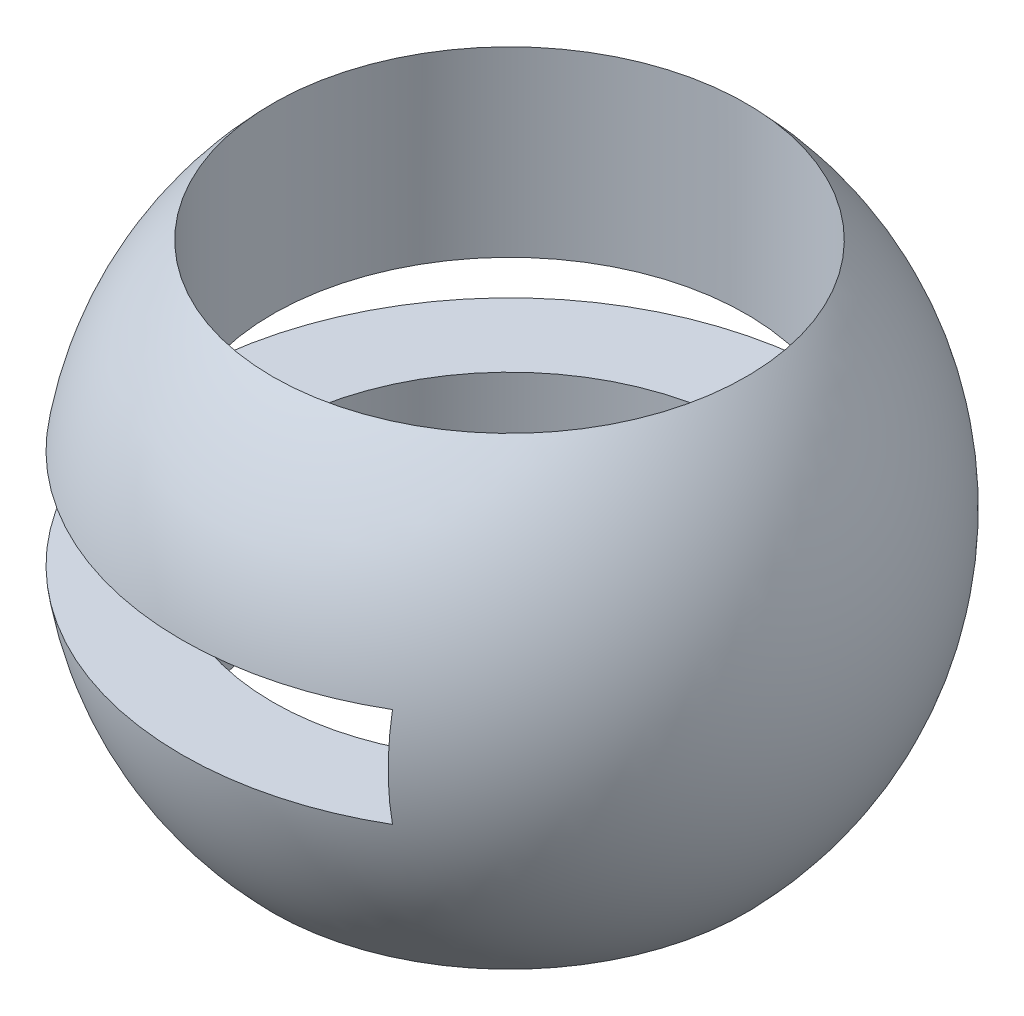
ISO-10303-21;
HEADER;
FILE_DESCRIPTION(('STEP AP214'),'2;1');
FILE_NAME('part.step','',(''),(''),'','','');
FILE_SCHEMA(('AUTOMOTIVE_DESIGN { 1 0 10303 214 1 1 1 1 }'));
ENDSEC;
DATA;
#1=APPLICATION_CONTEXT('core data for automotive mechanical design processes');
#2=APPLICATION_PROTOCOL_DEFINITION('international standard','automotive_design',2000,#1);
#3=PRODUCT_CONTEXT('',#1,'mechanical');
#4=PRODUCT('Part','Part','',(#3));
#5=PRODUCT_RELATED_PRODUCT_CATEGORY('part','',(#4));
#6=PRODUCT_DEFINITION_FORMATION('','',#4);
#7=PRODUCT_DEFINITION_CONTEXT('part definition',#1,'design');
#8=PRODUCT_DEFINITION('design','',#6,#7);
#9=PRODUCT_DEFINITION_SHAPE('','',#8);
#10=(LENGTH_UNIT() NAMED_UNIT(*) SI_UNIT(.MILLI.,.METRE.));
#11=(NAMED_UNIT(*) PLANE_ANGLE_UNIT() SI_UNIT($,.RADIAN.));
#12=(NAMED_UNIT(*) SI_UNIT($,.STERADIAN.) SOLID_ANGLE_UNIT());
#13=UNCERTAINTY_MEASURE_WITH_UNIT(LENGTH_MEASURE(1.E-05),#10,'distance_accuracy_value','');
#14=(GEOMETRIC_REPRESENTATION_CONTEXT(3) GLOBAL_UNCERTAINTY_ASSIGNED_CONTEXT((#13)) GLOBAL_UNIT_ASSIGNED_CONTEXT((#10,
#11,#12)) REPRESENTATION_CONTEXT('',''));
#15=CARTESIAN_POINT('',(0.,0.,0.));
#16=DIRECTION('',(0.,0.,1.));
#17=DIRECTION('',(1.,0.,0.));
#18=AXIS2_PLACEMENT_3D('',#15,#16,#17);
#19=CARTESIAN_POINT('',(0.,0.,0.));
#20=DIRECTION('',(0.,1.,0.));
#21=DIRECTION('',(1.,0.,0.));
#22=AXIS2_PLACEMENT_3D('',#19,#20,#21);
#23=SPHERICAL_SURFACE('',#22,100.);
#24=CARTESIAN_POINT('',(0.,-70.,0.));
#25=DIRECTION('',(0.,1.,0.));
#26=DIRECTION('',(0.,0.,1.));
#27=AXIS2_PLACEMENT_3D('',#24,#25,#26);
#28=CIRCLE('',#27,71.4142842854285);
#29=CARTESIAN_POINT('',(0.,-70.,71.4142842854285));
#30=VERTEX_POINT('',#29);
#31=EDGE_CURVE('E98',#30,#30,#28,.T.);
#32=ORIENTED_EDGE('',*,*,#31,.T.);
#33=EDGE_LOOP('',(#32));
#34=FACE_BOUND('',#33,.T.);
#35=CARTESIAN_POINT('',(0.,70.,0.));
#36=DIRECTION('',(0.,1.,0.));
#37=DIRECTION('',(0.,0.,1.));
#38=AXIS2_PLACEMENT_3D('',#35,#36,#37);
#39=CIRCLE('',#38,71.4142842854285);
#40=CARTESIAN_POINT('',(0.,70.,71.4142842854285));
#41=VERTEX_POINT('',#40);
#42=EDGE_CURVE('E95',#41,#41,#39,.T.);
#43=ORIENTED_EDGE('',*,*,#42,.F.);
#44=EDGE_LOOP('',(#43));
#45=FACE_BOUND('',#44,.T.);
#46=CARTESIAN_POINT('',(0.,15.,0.));
#47=DIRECTION('',(0.,-1.,0.));
#48=DIRECTION('',(0.,0.,-1.));
#49=AXIS2_PLACEMENT_3D('',#46,#47,#48);
#50=CIRCLE('',#49,98.8685996664259);
#51=CARTESIAN_POINT('',(50.,15.,85.2936105461599));
#52=VERTEX_POINT('',#51);
#53=CARTESIAN_POINT('',(50.,15.,-85.2936105461599));
#54=VERTEX_POINT('',#53);
#55=EDGE_CURVE('E80',#52,#54,#50,.T.);
#56=ORIENTED_EDGE('',*,*,#55,.F.);
#57=CARTESIAN_POINT('',(50.,0.,0.));
#58=DIRECTION('',(-1.,0.,0.));
#59=DIRECTION('',(0.,0.,1.));
#60=AXIS2_PLACEMENT_3D('',#57,#58,#59);
#61=CIRCLE('',#60,86.6025403784438);
#62=CARTESIAN_POINT('',(50.,-15.,85.2936105461599));
#63=VERTEX_POINT('',#62);
#64=EDGE_CURVE('E86',#63,#52,#61,.T.);
#65=ORIENTED_EDGE('',*,*,#64,.F.);
#66=CARTESIAN_POINT('',(0.,-15.,0.));
#67=DIRECTION('',(0.,1.,0.));
#68=DIRECTION('',(0.,0.,1.));
#69=AXIS2_PLACEMENT_3D('',#66,#67,#68);
#70=CIRCLE('',#69,98.8685996664259);
#71=CARTESIAN_POINT('',(50.,-15.,-85.2936105461599));
#72=VERTEX_POINT('',#71);
#73=EDGE_CURVE('E75',#72,#63,#70,.T.);
#74=ORIENTED_EDGE('',*,*,#73,.F.);
#75=EDGE_CURVE('E93',#54,#72,#61,.T.);
#76=ORIENTED_EDGE('',*,*,#75,.F.);
#77=EDGE_LOOP('',(#56,#65,#74,#76));
#78=FACE_BOUND('',#77,.T.);
#79=ADVANCED_FACE('F39',(#34,#45,#78),#23,.T.);
#80=CARTESIAN_POINT('',(0.,-70.,0.));
#81=DIRECTION('',(0.,1.,0.));
#82=DIRECTION('',(0.,0.,1.));
#83=AXIS2_PLACEMENT_3D('',#80,#81,#82);
#84=CYLINDRICAL_SURFACE('',#83,71.4142842854285);
#85=ORIENTED_EDGE('',*,*,#42,.T.);
#86=EDGE_LOOP('',(#85));
#87=FACE_BOUND('',#86,.T.);
#88=ORIENTED_EDGE('',*,*,#31,.F.);
#89=EDGE_LOOP('',(#88));
#90=FACE_BOUND('',#89,.T.);
#91=CARTESIAN_POINT('',(0.,15.,0.));
#92=DIRECTION('',(0.,-1.,0.));
#93=DIRECTION('',(0.,0.,-1.));
#94=AXIS2_PLACEMENT_3D('',#91,#92,#93);
#95=CIRCLE('',#94,71.4142842854285);
#96=CARTESIAN_POINT('',(50.,15.,-50.9901951359278));
#97=VERTEX_POINT('',#96);
#98=CARTESIAN_POINT('',(50.,15.,50.9901951359278));
#99=VERTEX_POINT('',#98);
#100=EDGE_CURVE('E11',#97,#99,#95,.F.);
#101=ORIENTED_EDGE('',*,*,#100,.F.);
#102=DIRECTION('',(0.,1.,0.));
#103=VECTOR('',#102,1.);
#104=CARTESIAN_POINT('',(50.,-70.,-50.9901951359278));
#105=LINE('',#104,#103);
#106=CARTESIAN_POINT('',(50.,-15.,-50.9901951359278));
#107=VERTEX_POINT('',#106);
#108=EDGE_CURVE('E105',#107,#97,#105,.T.);
#109=ORIENTED_EDGE('',*,*,#108,.F.);
#110=CARTESIAN_POINT('',(0.,-15.,0.));
#111=DIRECTION('',(0.,1.,0.));
#112=DIRECTION('',(0.,0.,1.));
#113=AXIS2_PLACEMENT_3D('',#110,#111,#112);
#114=CIRCLE('',#113,71.4142842854285);
#115=CARTESIAN_POINT('',(50.,-15.,50.9901951359278));
#116=VERTEX_POINT('',#115);
#117=EDGE_CURVE('E101',#116,#107,#114,.F.);
#118=ORIENTED_EDGE('',*,*,#117,.F.);
#119=DIRECTION('',(0.,1.,0.));
#120=VECTOR('',#119,1.);
#121=CARTESIAN_POINT('',(50.,-70.,50.9901951359278));
#122=LINE('',#121,#120);
#123=EDGE_CURVE('E46',#99,#116,#122,.F.);
#124=ORIENTED_EDGE('',*,*,#123,.F.);
#125=EDGE_LOOP('',(#101,#109,#118,#124));
#126=FACE_BOUND('',#125,.T.);
#127=ADVANCED_FACE('F116',(#87,#90,#126),#84,.F.);
#128=CARTESIAN_POINT('',(50.,0.,170.));
#129=DIRECTION('',(-1.,0.,0.));
#130=DIRECTION('',(0.,0.,1.));
#131=AXIS2_PLACEMENT_3D('',#128,#129,#130);
#132=PLANE('',#131);
#133=ORIENTED_EDGE('',*,*,#75,.T.);
#134=DIRECTION('',(0.,0.,-1.));
#135=VECTOR('',#134,1.);
#136=CARTESIAN_POINT('',(50.,-15.,170.));
#137=LINE('',#136,#135);
#138=EDGE_CURVE('E53',#107,#72,#137,.T.);
#139=ORIENTED_EDGE('',*,*,#138,.F.);
#140=ORIENTED_EDGE('',*,*,#108,.T.);
#141=DIRECTION('',(0.,0.,-1.));
#142=VECTOR('',#141,1.);
#143=CARTESIAN_POINT('',(50.,15.,170.));
#144=LINE('',#143,#142);
#145=EDGE_CURVE('E90',#97,#54,#144,.T.);
#146=ORIENTED_EDGE('',*,*,#145,.T.);
#147=EDGE_LOOP('',(#133,#139,#140,#146));
#148=FACE_BOUND('',#147,.T.);
#149=ADVANCED_FACE('F110',(#148),#132,.T.);
#150=ORIENTED_EDGE('',*,*,#64,.T.);
#151=EDGE_CURVE('E81',#52,#99,#144,.T.);
#152=ORIENTED_EDGE('',*,*,#151,.T.);
#153=ORIENTED_EDGE('',*,*,#123,.T.);
#154=EDGE_CURVE('E58',#63,#116,#137,.T.);
#155=ORIENTED_EDGE('',*,*,#154,.F.);
#156=EDGE_LOOP('',(#150,#152,#153,#155));
#157=FACE_BOUND('',#156,.T.);
#158=ADVANCED_FACE('F84',(#157),#132,.T.);
#159=CARTESIAN_POINT('',(-100.,15.,170.));
#160=DIRECTION('',(0.,-1.,0.));
#161=DIRECTION('',(0.,0.,-1.));
#162=AXIS2_PLACEMENT_3D('',#159,#160,#161);
#163=PLANE('',#162);
#164=ORIENTED_EDGE('',*,*,#55,.T.);
#165=ORIENTED_EDGE('',*,*,#145,.F.);
#166=ORIENTED_EDGE('',*,*,#100,.T.);
#167=ORIENTED_EDGE('',*,*,#151,.F.);
#168=EDGE_LOOP('',(#164,#165,#166,#167));
#169=FACE_BOUND('',#168,.T.);
#170=ADVANCED_FACE('F114',(#169),#163,.T.);
#171=CARTESIAN_POINT('',(-100.,-15.,170.));
#172=DIRECTION('',(0.,1.,0.));
#173=DIRECTION('',(0.,0.,1.));
#174=AXIS2_PLACEMENT_3D('',#171,#172,#173);
#175=PLANE('',#174);
#176=ORIENTED_EDGE('',*,*,#73,.T.);
#177=ORIENTED_EDGE('',*,*,#154,.T.);
#178=ORIENTED_EDGE('',*,*,#117,.T.);
#179=ORIENTED_EDGE('',*,*,#138,.T.);
#180=EDGE_LOOP('',(#176,#177,#178,#179));
#181=FACE_BOUND('',#180,.T.);
#182=ADVANCED_FACE('F76',(#181),#175,.T.);
#183=CLOSED_SHELL('',(#79,#127,#149,#158,#170,#182));
#184=MANIFOLD_SOLID_BREP('B2',#183);
#185=ADVANCED_BREP_SHAPE_REPRESENTATION('',(#18,#184),#14);
#186=SHAPE_DEFINITION_REPRESENTATION(#9,#185);
ENDSEC;
END-ISO-10303-21;
